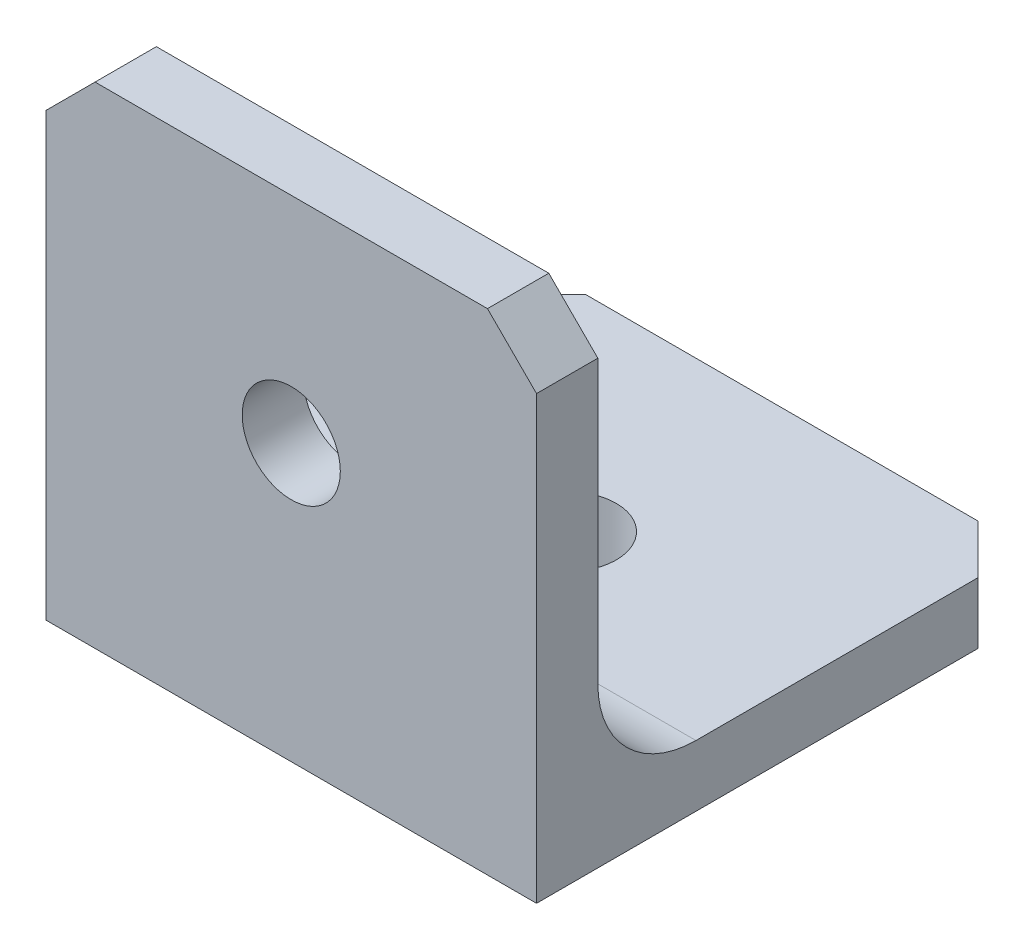
ISO-10303-21;
HEADER;
FILE_DESCRIPTION(('STEP AP214'),'2;1');
FILE_NAME('part.step','',(''),(''),'','','');
FILE_SCHEMA(('AUTOMOTIVE_DESIGN { 1 0 10303 214 1 1 1 1 }'));
ENDSEC;
DATA;
#1=APPLICATION_CONTEXT('core data for automotive mechanical design processes');
#2=APPLICATION_PROTOCOL_DEFINITION('international standard','automotive_design',2000,#1);
#3=PRODUCT_CONTEXT('',#1,'mechanical');
#4=PRODUCT('Part','Part','',(#3));
#5=PRODUCT_RELATED_PRODUCT_CATEGORY('part','',(#4));
#6=PRODUCT_DEFINITION_FORMATION('','',#4);
#7=PRODUCT_DEFINITION_CONTEXT('part definition',#1,'design');
#8=PRODUCT_DEFINITION('design','',#6,#7);
#9=PRODUCT_DEFINITION_SHAPE('','',#8);
#10=(LENGTH_UNIT() NAMED_UNIT(*) SI_UNIT(.MILLI.,.METRE.));
#11=(NAMED_UNIT(*) PLANE_ANGLE_UNIT() SI_UNIT($,.RADIAN.));
#12=(NAMED_UNIT(*) SI_UNIT($,.STERADIAN.) SOLID_ANGLE_UNIT());
#13=UNCERTAINTY_MEASURE_WITH_UNIT(LENGTH_MEASURE(1.E-05),#10,'distance_accuracy_value','');
#14=(GEOMETRIC_REPRESENTATION_CONTEXT(3) GLOBAL_UNCERTAINTY_ASSIGNED_CONTEXT((#13)) GLOBAL_UNIT_ASSIGNED_CONTEXT((#10,
#11,#12)) REPRESENTATION_CONTEXT('',''));
#15=CARTESIAN_POINT('',(0.,0.,0.));
#16=DIRECTION('',(0.,0.,1.));
#17=DIRECTION('',(1.,0.,0.));
#18=AXIS2_PLACEMENT_3D('',#15,#16,#17);
#19=CARTESIAN_POINT('',(25.4,0.,-25.4));
#20=DIRECTION('',(0.,1.,0.));
#21=DIRECTION('',(0.,0.,1.));
#22=AXIS2_PLACEMENT_3D('',#19,#20,#21);
#23=PLANE('',#22);
#24=CARTESIAN_POINT('',(12.7,0.,-14.2875));
#25=DIRECTION('',(0.,-1.,0.));
#26=DIRECTION('',(0.,0.,-1.));
#27=AXIS2_PLACEMENT_3D('',#24,#25,#26);
#28=CIRCLE('',#27,2.54);
#29=CARTESIAN_POINT('',(12.7,0.,-16.8275));
#30=VERTEX_POINT('',#29);
#31=EDGE_CURVE('E179',#30,#30,#28,.T.);
#32=ORIENTED_EDGE('',*,*,#31,.F.);
#33=EDGE_LOOP('',(#32));
#34=FACE_BOUND('',#33,.T.);
#35=DIRECTION('',(0.,0.,-1.));
#36=VECTOR('',#35,1.);
#37=CARTESIAN_POINT('',(0.,0.,-25.4));
#38=LINE('',#37,#36);
#39=CARTESIAN_POINT('',(0.,0.,0.));
#40=VERTEX_POINT('',#39);
#41=CARTESIAN_POINT('',(0.,0.,-22.86));
#42=VERTEX_POINT('',#41);
#43=EDGE_CURVE('E159',#40,#42,#38,.T.);
#44=ORIENTED_EDGE('',*,*,#43,.T.);
#45=DIRECTION('',(0.707106781186546,0.,-0.707106781186549));
#46=VECTOR('',#45,1.);
#47=CARTESIAN_POINT('',(2.54,0.,-25.4));
#48=LINE('',#47,#46);
#49=CARTESIAN_POINT('',(2.54,0.,-25.4));
#50=VERTEX_POINT('',#49);
#51=EDGE_CURVE('E204',#42,#50,#48,.T.);
#52=ORIENTED_EDGE('',*,*,#51,.T.);
#53=DIRECTION('',(-1.,0.,0.));
#54=VECTOR('',#53,1.);
#55=CARTESIAN_POINT('',(25.4,0.,-25.4));
#56=LINE('',#55,#54);
#57=CARTESIAN_POINT('',(22.86,0.,-25.4));
#58=VERTEX_POINT('',#57);
#59=EDGE_CURVE('E171',#58,#50,#56,.T.);
#60=ORIENTED_EDGE('',*,*,#59,.F.);
#61=DIRECTION('',(-0.707106781186549,0.,-0.707106781186546));
#62=VECTOR('',#61,1.);
#63=CARTESIAN_POINT('',(25.4,0.,-22.86));
#64=LINE('',#63,#62);
#65=CARTESIAN_POINT('',(25.4,0.,-22.86));
#66=VERTEX_POINT('',#65);
#67=EDGE_CURVE('E148',#58,#66,#64,.F.);
#68=ORIENTED_EDGE('',*,*,#67,.T.);
#69=DIRECTION('',(0.,0.,-1.));
#70=VECTOR('',#69,1.);
#71=CARTESIAN_POINT('',(25.4,0.,-25.4));
#72=LINE('',#71,#70);
#73=CARTESIAN_POINT('',(25.4,0.,0.));
#74=VERTEX_POINT('',#73);
#75=EDGE_CURVE('E128',#74,#66,#72,.T.);
#76=ORIENTED_EDGE('',*,*,#75,.F.);
#77=DIRECTION('',(-1.,0.,0.));
#78=VECTOR('',#77,1.);
#79=CARTESIAN_POINT('',(25.4,0.,0.));
#80=LINE('',#79,#78);
#81=EDGE_CURVE('E134',#74,#40,#80,.T.);
#82=ORIENTED_EDGE('',*,*,#81,.T.);
#83=EDGE_LOOP('',(#44,#52,#60,#68,#76,#82));
#84=FACE_BOUND('',#83,.T.);
#85=ADVANCED_FACE('F38',(#34,#84),#23,.F.);
#86=CARTESIAN_POINT('',(25.4,3.175,-25.4));
#87=DIRECTION('',(0.,0.,1.));
#88=DIRECTION('',(1.,0.,0.));
#89=AXIS2_PLACEMENT_3D('',#86,#87,#88);
#90=PLANE('',#89);
#91=ORIENTED_EDGE('',*,*,#59,.T.);
#92=DIRECTION('',(0.,1.,0.));
#93=VECTOR('',#92,1.);
#94=CARTESIAN_POINT('',(2.54,3.175,-25.4));
#95=LINE('',#94,#93);
#96=CARTESIAN_POINT('',(2.54,3.175,-25.4));
#97=VERTEX_POINT('',#96);
#98=EDGE_CURVE('E192',#50,#97,#95,.T.);
#99=ORIENTED_EDGE('',*,*,#98,.T.);
#100=DIRECTION('',(-1.,0.,0.));
#101=VECTOR('',#100,1.);
#102=CARTESIAN_POINT('',(25.4,3.175,-25.4));
#103=LINE('',#102,#101);
#104=CARTESIAN_POINT('',(22.86,3.175,-25.4));
#105=VERTEX_POINT('',#104);
#106=EDGE_CURVE('E168',#105,#97,#103,.T.);
#107=ORIENTED_EDGE('',*,*,#106,.F.);
#108=DIRECTION('',(0.,-1.,0.));
#109=VECTOR('',#108,1.);
#110=CARTESIAN_POINT('',(22.86,3.175,-25.4));
#111=LINE('',#110,#109);
#112=EDGE_CURVE('E190',#105,#58,#111,.T.);
#113=ORIENTED_EDGE('',*,*,#112,.T.);
#114=EDGE_LOOP('',(#91,#99,#107,#113));
#115=FACE_BOUND('',#114,.T.);
#116=ADVANCED_FACE('F241',(#115),#90,.F.);
#117=CARTESIAN_POINT('',(25.4,3.175,-3.17500000000001));
#118=DIRECTION('',(0.,-1.,0.));
#119=DIRECTION('',(0.,0.,-1.));
#120=AXIS2_PLACEMENT_3D('',#117,#118,#119);
#121=PLANE('',#120);
#122=CARTESIAN_POINT('',(12.7,3.175,-14.2875));
#123=DIRECTION('',(0.,-1.,0.));
#124=DIRECTION('',(0.,0.,-1.));
#125=AXIS2_PLACEMENT_3D('',#122,#123,#124);
#126=CIRCLE('',#125,2.54);
#127=CARTESIAN_POINT('',(12.7,3.175,-16.8275));
#128=VERTEX_POINT('',#127);
#129=EDGE_CURVE('E175',#128,#128,#126,.T.);
#130=ORIENTED_EDGE('',*,*,#129,.T.);
#131=EDGE_LOOP('',(#130));
#132=FACE_BOUND('',#131,.T.);
#133=ORIENTED_EDGE('',*,*,#106,.T.);
#134=DIRECTION('',(-0.707106781186546,0.,0.707106781186549));
#135=VECTOR('',#134,1.);
#136=CARTESIAN_POINT('',(2.54,3.175,-25.4));
#137=LINE('',#136,#135);
#138=CARTESIAN_POINT('',(0.,3.175,-22.86));
#139=VERTEX_POINT('',#138);
#140=EDGE_CURVE('E197',#97,#139,#137,.T.);
#141=ORIENTED_EDGE('',*,*,#140,.T.);
#142=DIRECTION('',(0.,0.,1.));
#143=VECTOR('',#142,1.);
#144=CARTESIAN_POINT('',(0.,3.175,-3.17500000000001));
#145=LINE('',#144,#143);
#146=CARTESIAN_POINT('',(0.,3.175,-8.25500000000001));
#147=VERTEX_POINT('',#146);
#148=EDGE_CURVE('E161',#139,#147,#145,.T.);
#149=ORIENTED_EDGE('',*,*,#148,.T.);
#150=DIRECTION('',(-1.,0.,0.));
#151=VECTOR('',#150,1.);
#152=CARTESIAN_POINT('',(25.4,3.175,-8.25500000000001));
#153=LINE('',#152,#151);
#154=CARTESIAN_POINT('',(25.4,3.175,-8.25500000000001));
#155=VERTEX_POINT('',#154);
#156=EDGE_CURVE('E182',#147,#155,#153,.F.);
#157=ORIENTED_EDGE('',*,*,#156,.T.);
#158=DIRECTION('',(0.,0.,1.));
#159=VECTOR('',#158,1.);
#160=CARTESIAN_POINT('',(25.4,3.175,-3.17500000000001));
#161=LINE('',#160,#159);
#162=CARTESIAN_POINT('',(25.4,3.175,-22.86));
#163=VERTEX_POINT('',#162);
#164=EDGE_CURVE('E149',#163,#155,#161,.T.);
#165=ORIENTED_EDGE('',*,*,#164,.F.);
#166=DIRECTION('',(0.707106781186549,0.,0.707106781186546));
#167=VECTOR('',#166,1.);
#168=CARTESIAN_POINT('',(25.4,3.175,-22.86));
#169=LINE('',#168,#167);
#170=EDGE_CURVE('E195',#163,#105,#169,.F.);
#171=ORIENTED_EDGE('',*,*,#170,.T.);
#172=EDGE_LOOP('',(#133,#141,#149,#157,#165,#171));
#173=FACE_BOUND('',#172,.T.);
#174=ADVANCED_FACE('F247',(#132,#173),#121,.F.);
#175=CARTESIAN_POINT('',(25.4,25.4,-3.175));
#176=DIRECTION('',(0.,0.,1.));
#177=DIRECTION('',(0.,-1.,0.));
#178=AXIS2_PLACEMENT_3D('',#175,#176,#177);
#179=PLANE('',#178);
#180=CARTESIAN_POINT('',(12.7,14.2875,-3.175));
#181=DIRECTION('',(0.,0.,1.));
#182=DIRECTION('',(0.,-1.,0.));
#183=AXIS2_PLACEMENT_3D('',#180,#181,#182);
#184=CIRCLE('',#183,2.54);
#185=CARTESIAN_POINT('',(12.7,11.7475,-3.175));
#186=VERTEX_POINT('',#185);
#187=EDGE_CURVE('E155',#186,#186,#184,.T.);
#188=ORIENTED_EDGE('',*,*,#187,.T.);
#189=EDGE_LOOP('',(#188));
#190=FACE_BOUND('',#189,.T.);
#191=DIRECTION('',(-1.,0.,0.));
#192=VECTOR('',#191,1.);
#193=CARTESIAN_POINT('',(25.4,25.4,-3.175));
#194=LINE('',#193,#192);
#195=CARTESIAN_POINT('',(22.86,25.4,-3.175));
#196=VERTEX_POINT('',#195);
#197=CARTESIAN_POINT('',(2.54,25.4,-3.175));
#198=VERTEX_POINT('',#197);
#199=EDGE_CURVE('E166',#196,#198,#194,.T.);
#200=ORIENTED_EDGE('',*,*,#199,.F.);
#201=DIRECTION('',(-0.707106781186549,0.707106781186546,0.));
#202=VECTOR('',#201,1.);
#203=CARTESIAN_POINT('',(25.4,22.86,-3.175));
#204=LINE('',#203,#202);
#205=CARTESIAN_POINT('',(25.4,22.86,-3.175));
#206=VERTEX_POINT('',#205);
#207=EDGE_CURVE('E11',#196,#206,#204,.F.);
#208=ORIENTED_EDGE('',*,*,#207,.T.);
#209=DIRECTION('',(0.,1.,0.));
#210=VECTOR('',#209,1.);
#211=CARTESIAN_POINT('',(25.4,25.4,-3.175));
#212=LINE('',#211,#210);
#213=CARTESIAN_POINT('',(25.4,8.255,-3.175));
#214=VERTEX_POINT('',#213);
#215=EDGE_CURVE('E135',#214,#206,#212,.T.);
#216=ORIENTED_EDGE('',*,*,#215,.F.);
#217=DIRECTION('',(-1.,0.,0.));
#218=VECTOR('',#217,1.);
#219=CARTESIAN_POINT('',(0.,8.255,-3.175));
#220=LINE('',#219,#218);
#221=CARTESIAN_POINT('',(0.,8.255,-3.175));
#222=VERTEX_POINT('',#221);
#223=EDGE_CURVE('E174',#214,#222,#220,.T.);
#224=ORIENTED_EDGE('',*,*,#223,.T.);
#225=DIRECTION('',(0.,1.,0.));
#226=VECTOR('',#225,1.);
#227=CARTESIAN_POINT('',(0.,25.4,-3.175));
#228=LINE('',#227,#226);
#229=CARTESIAN_POINT('',(0.,22.86,-3.175));
#230=VERTEX_POINT('',#229);
#231=EDGE_CURVE('E152',#222,#230,#228,.T.);
#232=ORIENTED_EDGE('',*,*,#231,.T.);
#233=DIRECTION('',(0.707106781186546,0.707106781186549,0.));
#234=VECTOR('',#233,1.);
#235=CARTESIAN_POINT('',(2.54,25.4,-3.175));
#236=LINE('',#235,#234);
#237=EDGE_CURVE('E47',#230,#198,#236,.T.);
#238=ORIENTED_EDGE('',*,*,#237,.T.);
#239=EDGE_LOOP('',(#200,#208,#216,#224,#232,#238));
#240=FACE_BOUND('',#239,.T.);
#241=ADVANCED_FACE('F223',(#190,#240),#179,.F.);
#242=CARTESIAN_POINT('',(25.4,25.4,0.));
#243=DIRECTION('',(0.,-1.,0.));
#244=DIRECTION('',(0.,0.,-1.));
#245=AXIS2_PLACEMENT_3D('',#242,#243,#244);
#246=PLANE('',#245);
#247=DIRECTION('',(-1.,0.,0.));
#248=VECTOR('',#247,1.);
#249=CARTESIAN_POINT('',(25.4,25.4,0.));
#250=LINE('',#249,#248);
#251=CARTESIAN_POINT('',(22.86,25.4,0.));
#252=VERTEX_POINT('',#251);
#253=CARTESIAN_POINT('',(2.54,25.4,0.));
#254=VERTEX_POINT('',#253);
#255=EDGE_CURVE('E144',#252,#254,#250,.T.);
#256=ORIENTED_EDGE('',*,*,#255,.F.);
#257=DIRECTION('',(0.,0.,-1.));
#258=VECTOR('',#257,1.);
#259=CARTESIAN_POINT('',(22.86,25.4,0.));
#260=LINE('',#259,#258);
#261=EDGE_CURVE('E60',#252,#196,#260,.T.);
#262=ORIENTED_EDGE('',*,*,#261,.T.);
#263=ORIENTED_EDGE('',*,*,#199,.T.);
#264=DIRECTION('',(0.,0.,1.));
#265=VECTOR('',#264,1.);
#266=CARTESIAN_POINT('',(2.54,25.4,0.));
#267=LINE('',#266,#265);
#268=EDGE_CURVE('E213',#198,#254,#267,.T.);
#269=ORIENTED_EDGE('',*,*,#268,.T.);
#270=EDGE_LOOP('',(#256,#262,#263,#269));
#271=FACE_BOUND('',#270,.T.);
#272=ADVANCED_FACE('F217',(#271),#246,.F.);
#273=CARTESIAN_POINT('',(25.4,0.,0.));
#274=DIRECTION('',(0.,0.,-1.));
#275=DIRECTION('',(-1.,0.,0.));
#276=AXIS2_PLACEMENT_3D('',#273,#274,#275);
#277=PLANE('',#276);
#278=CARTESIAN_POINT('',(12.7,14.2875,0.));
#279=DIRECTION('',(0.,0.,1.));
#280=DIRECTION('',(1.,0.,0.));
#281=AXIS2_PLACEMENT_3D('',#278,#279,#280);
#282=CIRCLE('',#281,2.54);
#283=CARTESIAN_POINT('',(15.24,14.2875,0.));
#284=VERTEX_POINT('',#283);
#285=EDGE_CURVE('E178',#284,#284,#282,.T.);
#286=ORIENTED_EDGE('',*,*,#285,.F.);
#287=EDGE_LOOP('',(#286));
#288=FACE_BOUND('',#287,.T.);
#289=DIRECTION('',(0.,-1.,0.));
#290=VECTOR('',#289,1.);
#291=CARTESIAN_POINT('',(25.4,0.,0.));
#292=LINE('',#291,#290);
#293=CARTESIAN_POINT('',(25.4,22.86,0.));
#294=VERTEX_POINT('',#293);
#295=EDGE_CURVE('E123',#294,#74,#292,.T.);
#296=ORIENTED_EDGE('',*,*,#295,.F.);
#297=DIRECTION('',(0.707106781186549,-0.707106781186546,0.));
#298=VECTOR('',#297,1.);
#299=CARTESIAN_POINT('',(25.4,22.86,0.));
#300=LINE('',#299,#298);
#301=EDGE_CURVE('E211',#294,#252,#300,.F.);
#302=ORIENTED_EDGE('',*,*,#301,.T.);
#303=ORIENTED_EDGE('',*,*,#255,.T.);
#304=DIRECTION('',(-0.707106781186546,-0.707106781186549,0.));
#305=VECTOR('',#304,1.);
#306=CARTESIAN_POINT('',(2.54,25.4,0.));
#307=LINE('',#306,#305);
#308=CARTESIAN_POINT('',(0.,22.86,0.));
#309=VERTEX_POINT('',#308);
#310=EDGE_CURVE('E209',#254,#309,#307,.T.);
#311=ORIENTED_EDGE('',*,*,#310,.T.);
#312=DIRECTION('',(0.,-1.,0.));
#313=VECTOR('',#312,1.);
#314=CARTESIAN_POINT('',(0.,0.,0.));
#315=LINE('',#314,#313);
#316=EDGE_CURVE('E140',#309,#40,#315,.T.);
#317=ORIENTED_EDGE('',*,*,#316,.T.);
#318=ORIENTED_EDGE('',*,*,#81,.F.);
#319=EDGE_LOOP('',(#296,#302,#303,#311,#317,#318));
#320=FACE_BOUND('',#319,.T.);
#321=ADVANCED_FACE('F138',(#288,#320),#277,.F.);
#322=CARTESIAN_POINT('',(25.4,0.,0.));
#323=DIRECTION('',(-1.,0.,0.));
#324=DIRECTION('',(0.,0.,1.));
#325=AXIS2_PLACEMENT_3D('',#322,#323,#324);
#326=PLANE('',#325);
#327=ORIENTED_EDGE('',*,*,#75,.T.);
#328=DIRECTION('',(0.,1.,0.));
#329=VECTOR('',#328,1.);
#330=CARTESIAN_POINT('',(25.4,0.,-22.86));
#331=LINE('',#330,#329);
#332=EDGE_CURVE('E207',#66,#163,#331,.T.);
#333=ORIENTED_EDGE('',*,*,#332,.T.);
#334=ORIENTED_EDGE('',*,*,#164,.T.);
#335=CARTESIAN_POINT('',(25.4,8.255,-8.25500000000001));
#336=DIRECTION('',(-1.,0.,0.));
#337=DIRECTION('',(0.,0.,1.));
#338=AXIS2_PLACEMENT_3D('',#335,#336,#337);
#339=CIRCLE('',#338,5.08);
#340=EDGE_CURVE('E188',#155,#214,#339,.T.);
#341=ORIENTED_EDGE('',*,*,#340,.T.);
#342=ORIENTED_EDGE('',*,*,#215,.T.);
#343=DIRECTION('',(0.,0.,1.));
#344=VECTOR('',#343,1.);
#345=CARTESIAN_POINT('',(25.4,22.86,0.));
#346=LINE('',#345,#344);
#347=EDGE_CURVE('E132',#206,#294,#346,.T.);
#348=ORIENTED_EDGE('',*,*,#347,.T.);
#349=ORIENTED_EDGE('',*,*,#295,.T.);
#350=EDGE_LOOP('',(#327,#333,#334,#341,#342,#348,#349));
#351=FACE_BOUND('',#350,.T.);
#352=ADVANCED_FACE('F125',(#351),#326,.F.);
#353=CARTESIAN_POINT('',(0.,0.,0.));
#354=DIRECTION('',(-1.,0.,0.));
#355=DIRECTION('',(0.,0.,1.));
#356=AXIS2_PLACEMENT_3D('',#353,#354,#355);
#357=PLANE('',#356);
#358=ORIENTED_EDGE('',*,*,#148,.F.);
#359=DIRECTION('',(0.,-1.,0.));
#360=VECTOR('',#359,1.);
#361=CARTESIAN_POINT('',(0.,0.,-22.86));
#362=LINE('',#361,#360);
#363=EDGE_CURVE('E201',#139,#42,#362,.T.);
#364=ORIENTED_EDGE('',*,*,#363,.T.);
#365=ORIENTED_EDGE('',*,*,#43,.F.);
#366=ORIENTED_EDGE('',*,*,#316,.F.);
#367=DIRECTION('',(0.,0.,-1.));
#368=VECTOR('',#367,1.);
#369=CARTESIAN_POINT('',(0.,22.86,-3.175));
#370=LINE('',#369,#368);
#371=EDGE_CURVE('E199',#309,#230,#370,.T.);
#372=ORIENTED_EDGE('',*,*,#371,.T.);
#373=ORIENTED_EDGE('',*,*,#231,.F.);
#374=CARTESIAN_POINT('',(0.,8.255,-8.25500000000001));
#375=DIRECTION('',(-1.,0.,0.));
#376=DIRECTION('',(0.,0.,1.));
#377=AXIS2_PLACEMENT_3D('',#374,#375,#376);
#378=CIRCLE('',#377,5.08);
#379=EDGE_CURVE('E185',#222,#147,#378,.F.);
#380=ORIENTED_EDGE('',*,*,#379,.T.);
#381=EDGE_LOOP('',(#358,#364,#365,#366,#372,#373,#380));
#382=FACE_BOUND('',#381,.T.);
#383=ADVANCED_FACE('F233',(#382),#357,.T.);
#384=CARTESIAN_POINT('',(12.7,14.2875,-25.4));
#385=DIRECTION('',(0.,0.,1.));
#386=DIRECTION('',(1.,0.,0.));
#387=AXIS2_PLACEMENT_3D('',#384,#385,#386);
#388=CYLINDRICAL_SURFACE('',#387,2.54);
#389=ORIENTED_EDGE('',*,*,#285,.T.);
#390=EDGE_LOOP('',(#389));
#391=FACE_BOUND('',#390,.T.);
#392=ORIENTED_EDGE('',*,*,#187,.F.);
#393=EDGE_LOOP('',(#392));
#394=FACE_BOUND('',#393,.T.);
#395=ADVANCED_FACE('F296',(#391,#394),#388,.F.);
#396=CARTESIAN_POINT('',(12.7,25.4,-14.2875));
#397=DIRECTION('',(0.,-1.,0.));
#398=DIRECTION('',(0.,0.,-1.));
#399=AXIS2_PLACEMENT_3D('',#396,#397,#398);
#400=CYLINDRICAL_SURFACE('',#399,2.54);
#401=ORIENTED_EDGE('',*,*,#31,.T.);
#402=EDGE_LOOP('',(#401));
#403=FACE_BOUND('',#402,.T.);
#404=ORIENTED_EDGE('',*,*,#129,.F.);
#405=EDGE_LOOP('',(#404));
#406=FACE_BOUND('',#405,.T.);
#407=ADVANCED_FACE('F256',(#403,#406),#400,.F.);
#408=CARTESIAN_POINT('',(25.4,8.255,-8.25500000000001));
#409=DIRECTION('',(1.,0.,0.));
#410=DIRECTION('',(0.,0.,-1.));
#411=AXIS2_PLACEMENT_3D('',#408,#409,#410);
#412=CYLINDRICAL_SURFACE('',#411,5.08);
#413=ORIENTED_EDGE('',*,*,#340,.F.);
#414=ORIENTED_EDGE('',*,*,#156,.F.);
#415=ORIENTED_EDGE('',*,*,#379,.F.);
#416=ORIENTED_EDGE('',*,*,#223,.F.);
#417=EDGE_LOOP('',(#413,#414,#415,#416));
#418=FACE_BOUND('',#417,.T.);
#419=ADVANCED_FACE('F229',(#418),#412,.F.);
#420=CARTESIAN_POINT('',(2.54,3.175,-25.4));
#421=DIRECTION('',(-0.707106781186549,0.,-0.707106781186546));
#422=DIRECTION('',(0.,-1.,0.));
#423=AXIS2_PLACEMENT_3D('',#420,#421,#422);
#424=PLANE('',#423);
#425=ORIENTED_EDGE('',*,*,#51,.F.);
#426=ORIENTED_EDGE('',*,*,#363,.F.);
#427=ORIENTED_EDGE('',*,*,#140,.F.);
#428=ORIENTED_EDGE('',*,*,#98,.F.);
#429=EDGE_LOOP('',(#425,#426,#427,#428));
#430=FACE_BOUND('',#429,.T.);
#431=ADVANCED_FACE('F255',(#430),#424,.T.);
#432=CARTESIAN_POINT('',(25.4,0.,-22.86));
#433=DIRECTION('',(-0.707106781186546,0.,0.707106781186549));
#434=DIRECTION('',(0.,1.,0.));
#435=AXIS2_PLACEMENT_3D('',#432,#433,#434);
#436=PLANE('',#435);
#437=ORIENTED_EDGE('',*,*,#67,.F.);
#438=ORIENTED_EDGE('',*,*,#112,.F.);
#439=ORIENTED_EDGE('',*,*,#170,.F.);
#440=ORIENTED_EDGE('',*,*,#332,.F.);
#441=EDGE_LOOP('',(#437,#438,#439,#440));
#442=FACE_BOUND('',#441,.T.);
#443=ADVANCED_FACE('F239',(#442),#436,.F.);
#444=CARTESIAN_POINT('',(25.4,22.86,0.));
#445=DIRECTION('',(-0.707106781186546,-0.707106781186549,0.));
#446=DIRECTION('',(0.,0.,1.));
#447=AXIS2_PLACEMENT_3D('',#444,#445,#446);
#448=PLANE('',#447);
#449=ORIENTED_EDGE('',*,*,#207,.F.);
#450=ORIENTED_EDGE('',*,*,#261,.F.);
#451=ORIENTED_EDGE('',*,*,#301,.F.);
#452=ORIENTED_EDGE('',*,*,#347,.F.);
#453=EDGE_LOOP('',(#449,#450,#451,#452));
#454=FACE_BOUND('',#453,.T.);
#455=ADVANCED_FACE('F221',(#454),#448,.F.);
#456=CARTESIAN_POINT('',(2.54,25.4,0.));
#457=DIRECTION('',(-0.707106781186549,0.707106781186546,0.));
#458=DIRECTION('',(0.,0.,-1.));
#459=AXIS2_PLACEMENT_3D('',#456,#457,#458);
#460=PLANE('',#459);
#461=ORIENTED_EDGE('',*,*,#237,.F.);
#462=ORIENTED_EDGE('',*,*,#371,.F.);
#463=ORIENTED_EDGE('',*,*,#310,.F.);
#464=ORIENTED_EDGE('',*,*,#268,.F.);
#465=EDGE_LOOP('',(#461,#462,#463,#464));
#466=FACE_BOUND('',#465,.T.);
#467=ADVANCED_FACE('F41',(#466),#460,.T.);
#468=CLOSED_SHELL('',(#85,#116,#174,#241,#272,#321,#352,#383,#395,#407,#419,#431,#443,#455,#467));
#469=MANIFOLD_SOLID_BREP('B2',#468);
#470=ADVANCED_BREP_SHAPE_REPRESENTATION('',(#18,#469),#14);
#471=SHAPE_DEFINITION_REPRESENTATION(#9,#470);
ENDSEC;
END-ISO-10303-21;
